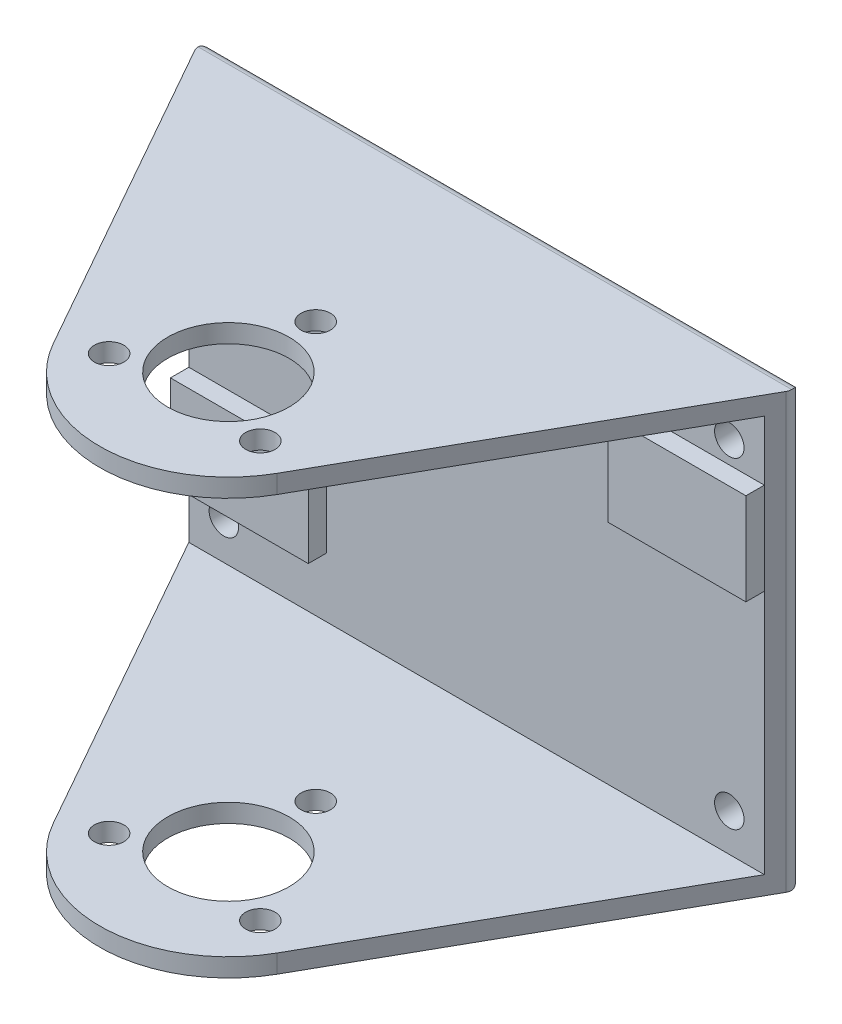
ISO-10303-21;
HEADER;
FILE_DESCRIPTION(('STEP AP214'),'2;1');
FILE_NAME('part.step','',(''),(''),'','','');
FILE_SCHEMA(('AUTOMOTIVE_DESIGN { 1 0 10303 214 1 1 1 1 }'));
ENDSEC;
DATA;
#1=APPLICATION_CONTEXT('core data for automotive mechanical design processes');
#2=APPLICATION_PROTOCOL_DEFINITION('international standard','automotive_design',2000,#1);
#3=PRODUCT_CONTEXT('',#1,'mechanical');
#4=PRODUCT('Part','Part','',(#3));
#5=PRODUCT_RELATED_PRODUCT_CATEGORY('part','',(#4));
#6=PRODUCT_DEFINITION_FORMATION('','',#4);
#7=PRODUCT_DEFINITION_CONTEXT('part definition',#1,'design');
#8=PRODUCT_DEFINITION('design','',#6,#7);
#9=PRODUCT_DEFINITION_SHAPE('','',#8);
#10=(LENGTH_UNIT() NAMED_UNIT(*) SI_UNIT(.MILLI.,.METRE.));
#11=(NAMED_UNIT(*) PLANE_ANGLE_UNIT() SI_UNIT($,.RADIAN.));
#12=(NAMED_UNIT(*) SI_UNIT($,.STERADIAN.) SOLID_ANGLE_UNIT());
#13=UNCERTAINTY_MEASURE_WITH_UNIT(LENGTH_MEASURE(1.E-05),#10,'distance_accuracy_value','');
#14=(GEOMETRIC_REPRESENTATION_CONTEXT(3) GLOBAL_UNCERTAINTY_ASSIGNED_CONTEXT((#13)) GLOBAL_UNIT_ASSIGNED_CONTEXT((#10,
#11,#12)) REPRESENTATION_CONTEXT('',''));
#15=CARTESIAN_POINT('',(0.,0.,0.));
#16=DIRECTION('',(0.,0.,1.));
#17=DIRECTION('',(1.,0.,0.));
#18=AXIS2_PLACEMENT_3D('',#15,#16,#17);
#19=CARTESIAN_POINT('',(0.,0.,-27.));
#20=DIRECTION('',(0.,0.,-1.));
#21=DIRECTION('',(-1.,0.,0.));
#22=AXIS2_PLACEMENT_3D('',#19,#20,#21);
#23=PLANE('',#22);
#24=CARTESIAN_POINT('',(27.5,6.1,-27.));
#25=DIRECTION('',(0.,0.,-1.));
#26=DIRECTION('',(-1.,0.,0.));
#27=AXIS2_PLACEMENT_3D('',#24,#25,#26);
#28=CIRCLE('',#27,1.6);
#29=CARTESIAN_POINT('',(25.9,6.1,-27.));
#30=VERTEX_POINT('',#29);
#31=EDGE_CURVE('E270',#30,#30,#28,.F.);
#32=ORIENTED_EDGE('',*,*,#31,.F.);
#33=EDGE_LOOP('',(#32));
#34=FACE_BOUND('',#33,.T.);
#35=CARTESIAN_POINT('',(-27.5,6.09999999999999,-27.));
#36=DIRECTION('',(0.,0.,-1.));
#37=DIRECTION('',(-1.,0.,0.));
#38=AXIS2_PLACEMENT_3D('',#35,#36,#37);
#39=CIRCLE('',#38,1.6);
#40=CARTESIAN_POINT('',(-29.1,6.09999999999999,-27.));
#41=VERTEX_POINT('',#40);
#42=EDGE_CURVE('E264',#41,#41,#39,.F.);
#43=ORIENTED_EDGE('',*,*,#42,.F.);
#44=EDGE_LOOP('',(#43));
#45=FACE_BOUND('',#44,.T.);
#46=CARTESIAN_POINT('',(-27.5,41.1,-27.));
#47=DIRECTION('',(0.,0.,-1.));
#48=DIRECTION('',(-1.,0.,0.));
#49=AXIS2_PLACEMENT_3D('',#46,#47,#48);
#50=CIRCLE('',#49,1.60000000000002);
#51=CARTESIAN_POINT('',(-29.1,41.1,-27.));
#52=VERTEX_POINT('',#51);
#53=EDGE_CURVE('E256',#52,#52,#50,.F.);
#54=ORIENTED_EDGE('',*,*,#53,.F.);
#55=EDGE_LOOP('',(#54));
#56=FACE_BOUND('',#55,.T.);
#57=CARTESIAN_POINT('',(27.5,41.1,-27.));
#58=DIRECTION('',(0.,0.,-1.));
#59=DIRECTION('',(-1.,0.,0.));
#60=AXIS2_PLACEMENT_3D('',#57,#58,#59);
#61=CIRCLE('',#60,1.60000000000001);
#62=CARTESIAN_POINT('',(25.9,41.1,-27.));
#63=VERTEX_POINT('',#62);
#64=EDGE_CURVE('E277',#63,#63,#61,.F.);
#65=ORIENTED_EDGE('',*,*,#64,.F.);
#66=EDGE_LOOP('',(#65));
#67=FACE_BOUND('',#66,.T.);
#68=DIRECTION('',(1.,0.,0.));
#69=VECTOR('',#68,1.);
#70=CARTESIAN_POINT('',(-31.3074444463326,8.5,-27.));
#71=LINE('',#70,#69);
#72=CARTESIAN_POINT('',(-31.3074444463326,8.5,-27.));
#73=VERTEX_POINT('',#72);
#74=CARTESIAN_POINT('',(-16.3074444463326,8.49999999999999,-27.));
#75=VERTEX_POINT('',#74);
#76=EDGE_CURVE('E190',#73,#75,#71,.T.);
#77=ORIENTED_EDGE('',*,*,#76,.F.);
#78=DIRECTION('',(0.,-1.,0.));
#79=VECTOR('',#78,1.);
#80=CARTESIAN_POINT('',(-31.3074444463326,0.,-27.));
#81=LINE('',#80,#79);
#82=CARTESIAN_POINT('',(-31.3074444463326,2.,-27.));
#83=VERTEX_POINT('',#82);
#84=EDGE_CURVE('E177',#73,#83,#81,.T.);
#85=ORIENTED_EDGE('',*,*,#84,.T.);
#86=DIRECTION('',(-1.,0.,0.));
#87=VECTOR('',#86,1.);
#88=CARTESIAN_POINT('',(33.,2.,-27.));
#89=LINE('',#88,#87);
#90=CARTESIAN_POINT('',(31.3074444463326,2.,-27.));
#91=VERTEX_POINT('',#90);
#92=EDGE_CURVE('E187',#91,#83,#89,.T.);
#93=ORIENTED_EDGE('',*,*,#92,.F.);
#94=DIRECTION('',(0.,1.,0.));
#95=VECTOR('',#94,1.);
#96=CARTESIAN_POINT('',(31.3074444463326,0.,-27.));
#97=LINE('',#96,#95);
#98=CARTESIAN_POINT('',(31.3074444463326,28.7,-27.));
#99=VERTEX_POINT('',#98);
#100=EDGE_CURVE('E335',#91,#99,#97,.T.);
#101=ORIENTED_EDGE('',*,*,#100,.T.);
#102=DIRECTION('',(1.,0.,0.));
#103=VECTOR('',#102,1.);
#104=CARTESIAN_POINT('',(31.3074444463326,28.7,-27.));
#105=LINE('',#104,#103);
#106=CARTESIAN_POINT('',(16.3074444463326,28.7,-27.));
#107=VERTEX_POINT('',#106);
#108=EDGE_CURVE('E227',#107,#99,#105,.T.);
#109=ORIENTED_EDGE('',*,*,#108,.F.);
#110=DIRECTION('',(0.,-1.,0.));
#111=VECTOR('',#110,1.);
#112=CARTESIAN_POINT('',(16.3074444463326,38.7,-27.));
#113=LINE('',#112,#111);
#114=CARTESIAN_POINT('',(16.3074444463326,38.7,-27.));
#115=VERTEX_POINT('',#114);
#116=EDGE_CURVE('E239',#115,#107,#113,.T.);
#117=ORIENTED_EDGE('',*,*,#116,.F.);
#118=DIRECTION('',(-1.,0.,0.));
#119=VECTOR('',#118,1.);
#120=CARTESIAN_POINT('',(31.3074444463326,38.7,-27.));
#121=LINE('',#120,#119);
#122=CARTESIAN_POINT('',(31.3074444463326,38.7,-27.));
#123=VERTEX_POINT('',#122);
#124=EDGE_CURVE('E236',#123,#115,#121,.T.);
#125=ORIENTED_EDGE('',*,*,#124,.F.);
#126=CARTESIAN_POINT('',(31.3074444463326,45.2,-27.));
#127=VERTEX_POINT('',#126);
#128=EDGE_CURVE('E334',#123,#127,#97,.T.);
#129=ORIENTED_EDGE('',*,*,#128,.T.);
#130=DIRECTION('',(1.,0.,0.));
#131=VECTOR('',#130,1.);
#132=CARTESIAN_POINT('',(-33.,45.2,-27.));
#133=LINE('',#132,#131);
#134=CARTESIAN_POINT('',(-31.3074444463326,45.2,-27.));
#135=VERTEX_POINT('',#134);
#136=EDGE_CURVE('E330',#135,#127,#133,.T.);
#137=ORIENTED_EDGE('',*,*,#136,.F.);
#138=CARTESIAN_POINT('',(-31.3074444463326,18.5,-27.));
#139=VERTEX_POINT('',#138);
#140=EDGE_CURVE('E186',#135,#139,#81,.T.);
#141=ORIENTED_EDGE('',*,*,#140,.T.);
#142=DIRECTION('',(-1.,0.,0.));
#143=VECTOR('',#142,1.);
#144=CARTESIAN_POINT('',(-31.3074444463326,18.5,-27.));
#145=LINE('',#144,#143);
#146=CARTESIAN_POINT('',(-16.3074444463326,18.5,-27.));
#147=VERTEX_POINT('',#146);
#148=EDGE_CURVE('E62',#147,#139,#145,.T.);
#149=ORIENTED_EDGE('',*,*,#148,.F.);
#150=DIRECTION('',(0.,1.,0.));
#151=VECTOR('',#150,1.);
#152=CARTESIAN_POINT('',(-16.3074444463326,8.49999999999999,-27.));
#153=LINE('',#152,#151);
#154=EDGE_CURVE('E57',#75,#147,#153,.T.);
#155=ORIENTED_EDGE('',*,*,#154,.F.);
#156=EDGE_LOOP('',(#77,#85,#93,#101,#109,#117,#125,#129,#137,#141,#149,#155));
#157=FACE_BOUND('',#156,.T.);
#158=ADVANCED_FACE('F40',(#34,#45,#56,#67,#157),#23,.F.);
#159=CARTESIAN_POINT('',(0.,47.2,0.));
#160=DIRECTION('',(0.,-1.,0.));
#161=DIRECTION('',(0.,0.,-1.));
#162=AXIS2_PLACEMENT_3D('',#159,#160,#161);
#163=CYLINDRICAL_SURFACE('',#162,14.);
#164=DIRECTION('',(0.,-1.,0.));
#165=VECTOR('',#164,1.);
#166=CARTESIAN_POINT('',(-12.1932674219114,47.2,6.87926083076917));
#167=LINE('',#166,#165);
#168=CARTESIAN_POINT('',(-12.1932674219114,47.2,6.87926083076917));
#169=VERTEX_POINT('',#168);
#170=CARTESIAN_POINT('',(-12.1932674219114,45.2,6.87926083076917));
#171=VERTEX_POINT('',#170);
#172=EDGE_CURVE('E356',#169,#171,#167,.T.);
#173=ORIENTED_EDGE('',*,*,#172,.T.);
#174=CARTESIAN_POINT('',(0.,45.2,0.));
#175=DIRECTION('',(0.,1.,0.));
#176=DIRECTION('',(0.,0.,1.));
#177=AXIS2_PLACEMENT_3D('',#174,#175,#176);
#178=CIRCLE('',#177,14.);
#179=CARTESIAN_POINT('',(12.1932674219114,45.2,6.87926083076916));
#180=VERTEX_POINT('',#179);
#181=EDGE_CURVE('E328',#180,#171,#178,.F.);
#182=ORIENTED_EDGE('',*,*,#181,.F.);
#183=DIRECTION('',(0.,-1.,0.));
#184=VECTOR('',#183,1.);
#185=CARTESIAN_POINT('',(12.1932674219114,47.2,6.87926083076917));
#186=LINE('',#185,#184);
#187=CARTESIAN_POINT('',(12.1932674219114,47.2,6.87926083076917));
#188=VERTEX_POINT('',#187);
#189=EDGE_CURVE('E360',#188,#180,#186,.T.);
#190=ORIENTED_EDGE('',*,*,#189,.F.);
#191=CARTESIAN_POINT('',(0.,47.2,0.));
#192=DIRECTION('',(0.,1.,0.));
#193=DIRECTION('',(0.,0.,-1.));
#194=AXIS2_PLACEMENT_3D('',#191,#192,#193);
#195=CIRCLE('',#194,14.);
#196=EDGE_CURVE('E340',#169,#188,#195,.T.);
#197=ORIENTED_EDGE('',*,*,#196,.F.);
#198=EDGE_LOOP('',(#173,#182,#190,#197));
#199=FACE_BOUND('',#198,.T.);
#200=ADVANCED_FACE('F424',(#199),#163,.T.);
#201=CARTESIAN_POINT('',(12.1932674219114,2.,6.87926083076916));
#202=VERTEX_POINT('',#201);
#203=CARTESIAN_POINT('',(12.1932674219114,0.,6.87926083076917));
#204=VERTEX_POINT('',#203);
#205=EDGE_CURVE('E359',#202,#204,#186,.T.);
#206=ORIENTED_EDGE('',*,*,#205,.F.);
#207=CARTESIAN_POINT('',(0.,2.,0.));
#208=DIRECTION('',(0.,-1.,0.));
#209=DIRECTION('',(0.,0.,-1.));
#210=AXIS2_PLACEMENT_3D('',#207,#208,#209);
#211=CIRCLE('',#210,14.);
#212=CARTESIAN_POINT('',(-12.1932674219114,2.,6.87926083076917));
#213=VERTEX_POINT('',#212);
#214=EDGE_CURVE('E337',#213,#202,#211,.F.);
#215=ORIENTED_EDGE('',*,*,#214,.F.);
#216=CARTESIAN_POINT('',(-12.1932674219114,0.,6.87926083076917));
#217=VERTEX_POINT('',#216);
#218=EDGE_CURVE('E349',#213,#217,#167,.T.);
#219=ORIENTED_EDGE('',*,*,#218,.T.);
#220=CARTESIAN_POINT('',(0.,0.,0.));
#221=DIRECTION('',(0.,1.,0.));
#222=DIRECTION('',(0.,0.,-1.));
#223=AXIS2_PLACEMENT_3D('',#220,#221,#222);
#224=CIRCLE('',#223,14.);
#225=EDGE_CURVE('E339',#217,#204,#224,.T.);
#226=ORIENTED_EDGE('',*,*,#225,.T.);
#227=EDGE_LOOP('',(#206,#215,#219,#226));
#228=FACE_BOUND('',#227,.T.);
#229=ADVANCED_FACE('F446',(#228),#163,.T.);
#230=CARTESIAN_POINT('',(33.,47.2,-30.));
#231=DIRECTION('',(-0.870947672993669,0.,-0.491375773626369));
#232=DIRECTION('',(-0.491375773626369,0.,0.870947672993669));
#233=AXIS2_PLACEMENT_3D('',#230,#231,#232);
#234=PLANE('',#233);
#235=DIRECTION('',(0.491375773626369,0.,-0.870947672993669));
#236=VECTOR('',#235,1.);
#237=CARTESIAN_POINT('',(33.,0.,-30.));
#238=LINE('',#237,#236);
#239=CARTESIAN_POINT('',(32.1585878839146,0.,-28.5086242263736));
#240=VERTEX_POINT('',#239);
#241=EDGE_CURVE('E352',#204,#240,#238,.T.);
#242=ORIENTED_EDGE('',*,*,#241,.T.);
#243=DIRECTION('',(0.,-1.,0.));
#244=VECTOR('',#243,1.);
#245=CARTESIAN_POINT('',(32.1585878839146,47.2,-28.5086242263736));
#246=LINE('',#245,#244);
#247=CARTESIAN_POINT('',(32.1585878839146,47.2,-28.5086242263736));
#248=VERTEX_POINT('',#247);
#249=EDGE_CURVE('E386',#240,#248,#246,.F.);
#250=ORIENTED_EDGE('',*,*,#249,.T.);
#251=DIRECTION('',(0.491375773626369,0.,-0.870947672993669));
#252=VECTOR('',#251,1.);
#253=CARTESIAN_POINT('',(33.,47.2,-30.));
#254=LINE('',#253,#252);
#255=EDGE_CURVE('E343',#188,#248,#254,.T.);
#256=ORIENTED_EDGE('',*,*,#255,.F.);
#257=ORIENTED_EDGE('',*,*,#189,.T.);
#258=DIRECTION('',(-0.491375773626369,0.,0.870947672993669));
#259=VECTOR('',#258,1.);
#260=CARTESIAN_POINT('',(-1.76649173307826,45.2,31.622482625898));
#261=LINE('',#260,#259);
#262=EDGE_CURVE('E326',#127,#180,#261,.T.);
#263=ORIENTED_EDGE('',*,*,#262,.F.);
#264=ORIENTED_EDGE('',*,*,#128,.F.);
#265=DIRECTION('',(0.,1.,0.));
#266=VECTOR('',#265,1.);
#267=CARTESIAN_POINT('',(31.3074444463326,38.7,-27.));
#268=LINE('',#267,#266);
#269=EDGE_CURVE('E194',#99,#123,#268,.T.);
#270=ORIENTED_EDGE('',*,*,#269,.F.);
#271=ORIENTED_EDGE('',*,*,#100,.F.);
#272=DIRECTION('',(0.491375773626369,0.,-0.870947672993669));
#273=VECTOR('',#272,1.);
#274=CARTESIAN_POINT('',(14.169218226778,2.,3.37695190994493));
#275=LINE('',#274,#273);
#276=EDGE_CURVE('E323',#202,#91,#275,.T.);
#277=ORIENTED_EDGE('',*,*,#276,.F.);
#278=ORIENTED_EDGE('',*,*,#205,.T.);
#279=EDGE_LOOP('',(#242,#250,#256,#257,#263,#264,#270,#271,#277,#278));
#280=FACE_BOUND('',#279,.T.);
#281=ADVANCED_FACE('F426',(#280),#234,.F.);
#282=CARTESIAN_POINT('',(-33.,47.2,-30.));
#283=DIRECTION('',(0.,0.,1.));
#284=DIRECTION('',(1.,0.,0.));
#285=AXIS2_PLACEMENT_3D('',#282,#283,#284);
#286=PLANE('',#285);
#287=DIRECTION('',(-1.,0.,0.));
#288=VECTOR('',#287,1.);
#289=CARTESIAN_POINT('',(-33.,46.2,-30.));
#290=LINE('',#289,#288);
#291=CARTESIAN_POINT('',(-31.2876402109209,46.2,-30.));
#292=VERTEX_POINT('',#291);
#293=CARTESIAN_POINT('',(31.2876402109209,46.2,-30.));
#294=VERTEX_POINT('',#293);
#295=EDGE_CURVE('E373',#292,#294,#290,.F.);
#296=ORIENTED_EDGE('',*,*,#295,.T.);
#297=DIRECTION('',(0.,-1.,0.));
#298=VECTOR('',#297,1.);
#299=CARTESIAN_POINT('',(31.2876402109209,47.2,-30.));
#300=LINE('',#299,#298);
#301=CARTESIAN_POINT('',(31.2876402109209,1.,-30.));
#302=VERTEX_POINT('',#301);
#303=EDGE_CURVE('E377',#294,#302,#300,.T.);
#304=ORIENTED_EDGE('',*,*,#303,.T.);
#305=DIRECTION('',(-1.,0.,0.));
#306=VECTOR('',#305,1.);
#307=CARTESIAN_POINT('',(-33.,1.,-30.));
#308=LINE('',#307,#306);
#309=CARTESIAN_POINT('',(-31.2876402109209,1.,-30.));
#310=VERTEX_POINT('',#309);
#311=EDGE_CURVE('E375',#302,#310,#308,.T.);
#312=ORIENTED_EDGE('',*,*,#311,.T.);
#313=DIRECTION('',(0.,-1.,0.));
#314=VECTOR('',#313,1.);
#315=CARTESIAN_POINT('',(-31.2876402109209,47.2,-30.));
#316=LINE('',#315,#314);
#317=EDGE_CURVE('E363',#310,#292,#316,.F.);
#318=ORIENTED_EDGE('',*,*,#317,.T.);
#319=EDGE_LOOP('',(#296,#304,#312,#318));
#320=FACE_BOUND('',#319,.T.);
#321=CARTESIAN_POINT('',(27.5,6.1,-30.));
#322=DIRECTION('',(0.,0.,-1.));
#323=DIRECTION('',(1.,0.,0.));
#324=AXIS2_PLACEMENT_3D('',#321,#322,#323);
#325=CIRCLE('',#324,1.6);
#326=CARTESIAN_POINT('',(29.1,6.1,-30.));
#327=VERTEX_POINT('',#326);
#328=EDGE_CURVE('E267',#327,#327,#325,.T.);
#329=ORIENTED_EDGE('',*,*,#328,.F.);
#330=EDGE_LOOP('',(#329));
#331=FACE_BOUND('',#330,.T.);
#332=CARTESIAN_POINT('',(-27.5,6.09999999999999,-30.));
#333=DIRECTION('',(0.,0.,-1.));
#334=DIRECTION('',(-1.,0.,0.));
#335=AXIS2_PLACEMENT_3D('',#332,#333,#334);
#336=CIRCLE('',#335,1.6);
#337=CARTESIAN_POINT('',(-29.1,6.09999999999999,-30.));
#338=VERTEX_POINT('',#337);
#339=EDGE_CURVE('E260',#338,#338,#336,.T.);
#340=ORIENTED_EDGE('',*,*,#339,.F.);
#341=EDGE_LOOP('',(#340));
#342=FACE_BOUND('',#341,.T.);
#343=CARTESIAN_POINT('',(-27.5,41.1,-30.));
#344=DIRECTION('',(0.,0.,-1.));
#345=DIRECTION('',(1.,0.,0.));
#346=AXIS2_PLACEMENT_3D('',#343,#344,#345);
#347=CIRCLE('',#346,1.60000000000002);
#348=CARTESIAN_POINT('',(-25.9,41.1,-30.));
#349=VERTEX_POINT('',#348);
#350=EDGE_CURVE('E259',#349,#349,#347,.T.);
#351=ORIENTED_EDGE('',*,*,#350,.F.);
#352=EDGE_LOOP('',(#351));
#353=FACE_BOUND('',#352,.T.);
#354=CARTESIAN_POINT('',(27.5,41.1,-30.));
#355=DIRECTION('',(0.,0.,-1.));
#356=DIRECTION('',(-1.,0.,0.));
#357=AXIS2_PLACEMENT_3D('',#354,#355,#356);
#358=CIRCLE('',#357,1.60000000000001);
#359=CARTESIAN_POINT('',(25.9,41.1,-30.));
#360=VERTEX_POINT('',#359);
#361=EDGE_CURVE('E263',#360,#360,#358,.T.);
#362=ORIENTED_EDGE('',*,*,#361,.F.);
#363=EDGE_LOOP('',(#362));
#364=FACE_BOUND('',#363,.T.);
#365=ADVANCED_FACE('F436',(#320,#331,#342,#353,#364),#286,.F.);
#366=CARTESIAN_POINT('',(-12.1932674219114,47.2,6.87926083076917));
#367=DIRECTION('',(0.870947672993669,0.,-0.491375773626369));
#368=DIRECTION('',(-0.491375773626369,0.,-0.870947672993669));
#369=AXIS2_PLACEMENT_3D('',#366,#367,#368);
#370=PLANE('',#369);
#371=DIRECTION('',(0.491375773626369,0.,0.870947672993669));
#372=VECTOR('',#371,1.);
#373=CARTESIAN_POINT('',(-12.1932674219114,47.2,6.87926083076917));
#374=LINE('',#373,#372);
#375=CARTESIAN_POINT('',(-32.1585878839146,47.2,-28.5086242263736));
#376=VERTEX_POINT('',#375);
#377=EDGE_CURVE('E347',#376,#169,#374,.T.);
#378=ORIENTED_EDGE('',*,*,#377,.F.);
#379=DIRECTION('',(0.,-1.,0.));
#380=VECTOR('',#379,1.);
#381=CARTESIAN_POINT('',(-32.1585878839146,47.2,-28.5086242263736));
#382=LINE('',#381,#380);
#383=CARTESIAN_POINT('',(-32.1585878839146,0.,-28.5086242263736));
#384=VERTEX_POINT('',#383);
#385=EDGE_CURVE('E11',#376,#384,#382,.T.);
#386=ORIENTED_EDGE('',*,*,#385,.T.);
#387=DIRECTION('',(0.491375773626369,0.,0.870947672993669));
#388=VECTOR('',#387,1.);
#389=CARTESIAN_POINT('',(-12.1932674219114,0.,6.87926083076917));
#390=LINE('',#389,#388);
#391=EDGE_CURVE('E344',#384,#217,#390,.T.);
#392=ORIENTED_EDGE('',*,*,#391,.T.);
#393=ORIENTED_EDGE('',*,*,#218,.F.);
#394=DIRECTION('',(0.491375773626369,0.,0.870947672993669));
#395=VECTOR('',#394,1.);
#396=CARTESIAN_POINT('',(1.76649173307827,2.,31.622482625898));
#397=LINE('',#396,#395);
#398=EDGE_CURVE('E184',#83,#213,#397,.T.);
#399=ORIENTED_EDGE('',*,*,#398,.F.);
#400=ORIENTED_EDGE('',*,*,#84,.F.);
#401=DIRECTION('',(0.,-1.,0.));
#402=VECTOR('',#401,1.);
#403=CARTESIAN_POINT('',(-31.3074444463326,8.5,-27.));
#404=LINE('',#403,#402);
#405=EDGE_CURVE('E182',#139,#73,#404,.T.);
#406=ORIENTED_EDGE('',*,*,#405,.F.);
#407=ORIENTED_EDGE('',*,*,#140,.F.);
#408=DIRECTION('',(-0.491375773626369,0.,-0.870947672993669));
#409=VECTOR('',#408,1.);
#410=CARTESIAN_POINT('',(-14.169218226778,45.2,3.37695190994493));
#411=LINE('',#410,#409);
#412=EDGE_CURVE('E321',#171,#135,#411,.T.);
#413=ORIENTED_EDGE('',*,*,#412,.F.);
#414=ORIENTED_EDGE('',*,*,#172,.F.);
#415=EDGE_LOOP('',(#378,#386,#392,#393,#399,#400,#406,#407,#413,#414));
#416=FACE_BOUND('',#415,.T.);
#417=ADVANCED_FACE('F179',(#416),#370,.F.);
#418=CARTESIAN_POINT('',(0.,47.2,0.));
#419=DIRECTION('',(0.,-1.,0.));
#420=DIRECTION('',(0.,0.,-1.));
#421=AXIS2_PLACEMENT_3D('',#418,#419,#420);
#422=PLANE('',#421);
#423=CARTESIAN_POINT('',(-8.22724133595217,47.2,4.75));
#424=DIRECTION('',(0.,1.,0.));
#425=DIRECTION('',(0.,0.,1.));
#426=AXIS2_PLACEMENT_3D('',#423,#424,#425);
#427=CIRCLE('',#426,1.6);
#428=CARTESIAN_POINT('',(-8.22724133595217,47.2,6.35));
#429=VERTEX_POINT('',#428);
#430=EDGE_CURVE('E281',#429,#429,#427,.T.);
#431=ORIENTED_EDGE('',*,*,#430,.F.);
#432=EDGE_LOOP('',(#431));
#433=FACE_BOUND('',#432,.T.);
#434=CARTESIAN_POINT('',(8.22724133595217,47.2,4.75000000000001));
#435=DIRECTION('',(0.,1.,0.));
#436=DIRECTION('',(0.,0.,1.));
#437=AXIS2_PLACEMENT_3D('',#434,#435,#436);
#438=CIRCLE('',#437,1.6);
#439=CARTESIAN_POINT('',(8.22724133595217,47.2,6.35000000000001));
#440=VERTEX_POINT('',#439);
#441=EDGE_CURVE('E285',#440,#440,#438,.T.);
#442=ORIENTED_EDGE('',*,*,#441,.F.);
#443=EDGE_LOOP('',(#442));
#444=FACE_BOUND('',#443,.T.);
#445=CARTESIAN_POINT('',(0.,47.2,0.));
#446=DIRECTION('',(0.,1.,0.));
#447=DIRECTION('',(0.,0.,1.));
#448=AXIS2_PLACEMENT_3D('',#445,#446,#447);
#449=CIRCLE('',#448,6.6);
#450=CARTESIAN_POINT('',(0.,47.2,6.6));
#451=VERTEX_POINT('',#450);
#452=EDGE_CURVE('E292',#451,#451,#449,.T.);
#453=ORIENTED_EDGE('',*,*,#452,.F.);
#454=EDGE_LOOP('',(#453));
#455=FACE_BOUND('',#454,.T.);
#456=CARTESIAN_POINT('',(0.,47.2,-9.5));
#457=DIRECTION('',(0.,1.,0.));
#458=DIRECTION('',(0.,0.,1.));
#459=AXIS2_PLACEMENT_3D('',#456,#457,#458);
#460=CIRCLE('',#459,1.6);
#461=CARTESIAN_POINT('',(0.,47.2,-7.9));
#462=VERTEX_POINT('',#461);
#463=EDGE_CURVE('E298',#462,#462,#460,.T.);
#464=ORIENTED_EDGE('',*,*,#463,.F.);
#465=EDGE_LOOP('',(#464));
#466=FACE_BOUND('',#465,.T.);
#467=ORIENTED_EDGE('',*,*,#255,.T.);
#468=CARTESIAN_POINT('',(31.2876402109209,47.2,-29.));
#469=DIRECTION('',(0.,-1.,0.));
#470=DIRECTION('',(0.,0.,-1.));
#471=AXIS2_PLACEMENT_3D('',#468,#469,#470);
#472=CIRCLE('',#471,1.);
#473=CARTESIAN_POINT('',(32.2876402109209,47.2,-29.));
#474=VERTEX_POINT('',#473);
#475=EDGE_CURVE('E49',#248,#474,#472,.F.);
#476=ORIENTED_EDGE('',*,*,#475,.T.);
#477=DIRECTION('',(-1.,0.,0.));
#478=VECTOR('',#477,1.);
#479=CARTESIAN_POINT('',(0.,47.2,-29.));
#480=LINE('',#479,#478);
#481=CARTESIAN_POINT('',(-32.2876402109209,47.2,-29.));
#482=VERTEX_POINT('',#481);
#483=EDGE_CURVE('E391',#474,#482,#480,.T.);
#484=ORIENTED_EDGE('',*,*,#483,.T.);
#485=CARTESIAN_POINT('',(-31.2876402109209,47.2,-29.));
#486=DIRECTION('',(0.,-1.,0.));
#487=DIRECTION('',(0.,0.,-1.));
#488=AXIS2_PLACEMENT_3D('',#485,#486,#487);
#489=CIRCLE('',#488,1.);
#490=EDGE_CURVE('E389',#482,#376,#489,.F.);
#491=ORIENTED_EDGE('',*,*,#490,.T.);
#492=ORIENTED_EDGE('',*,*,#377,.T.);
#493=ORIENTED_EDGE('',*,*,#196,.T.);
#494=EDGE_LOOP('',(#467,#476,#484,#491,#492,#493));
#495=FACE_BOUND('',#494,.T.);
#496=ADVANCED_FACE('F416',(#433,#444,#455,#466,#495),#422,.F.);
#497=CARTESIAN_POINT('',(0.,0.,0.));
#498=DIRECTION('',(0.,-1.,0.));
#499=DIRECTION('',(0.,0.,-1.));
#500=AXIS2_PLACEMENT_3D('',#497,#498,#499);
#501=PLANE('',#500);
#502=CARTESIAN_POINT('',(-8.22724133595217,0.,4.75));
#503=DIRECTION('',(0.,-1.,0.));
#504=DIRECTION('',(0.,0.,-1.));
#505=AXIS2_PLACEMENT_3D('',#502,#503,#504);
#506=CIRCLE('',#505,1.6);
#507=CARTESIAN_POINT('',(-8.22724133595217,0.,3.15));
#508=VERTEX_POINT('',#507);
#509=EDGE_CURVE('E284',#508,#508,#506,.F.);
#510=ORIENTED_EDGE('',*,*,#509,.T.);
#511=EDGE_LOOP('',(#510));
#512=FACE_BOUND('',#511,.T.);
#513=CARTESIAN_POINT('',(8.22724133595217,0.,4.75000000000001));
#514=DIRECTION('',(0.,-1.,0.));
#515=DIRECTION('',(0.,0.,-1.));
#516=AXIS2_PLACEMENT_3D('',#513,#514,#515);
#517=CIRCLE('',#516,1.6);
#518=CARTESIAN_POINT('',(8.22724133595217,0.,3.15));
#519=VERTEX_POINT('',#518);
#520=EDGE_CURVE('E289',#519,#519,#517,.F.);
#521=ORIENTED_EDGE('',*,*,#520,.T.);
#522=EDGE_LOOP('',(#521));
#523=FACE_BOUND('',#522,.T.);
#524=CARTESIAN_POINT('',(0.,0.,0.));
#525=DIRECTION('',(0.,-1.,0.));
#526=DIRECTION('',(0.,0.,-1.));
#527=AXIS2_PLACEMENT_3D('',#524,#525,#526);
#528=CIRCLE('',#527,6.6);
#529=CARTESIAN_POINT('',(0.,0.,-6.6));
#530=VERTEX_POINT('',#529);
#531=EDGE_CURVE('E295',#530,#530,#528,.F.);
#532=ORIENTED_EDGE('',*,*,#531,.T.);
#533=EDGE_LOOP('',(#532));
#534=FACE_BOUND('',#533,.T.);
#535=CARTESIAN_POINT('',(0.,0.,-9.5));
#536=DIRECTION('',(0.,-1.,0.));
#537=DIRECTION('',(0.,0.,-1.));
#538=AXIS2_PLACEMENT_3D('',#535,#536,#537);
#539=CIRCLE('',#538,1.6);
#540=CARTESIAN_POINT('',(0.,0.,-11.1));
#541=VERTEX_POINT('',#540);
#542=EDGE_CURVE('E280',#541,#541,#539,.F.);
#543=ORIENTED_EDGE('',*,*,#542,.T.);
#544=EDGE_LOOP('',(#543));
#545=FACE_BOUND('',#544,.T.);
#546=DIRECTION('',(-1.,0.,0.));
#547=VECTOR('',#546,1.);
#548=CARTESIAN_POINT('',(33.,0.,-29.));
#549=LINE('',#548,#547);
#550=CARTESIAN_POINT('',(-32.2876402109209,0.,-29.));
#551=VERTEX_POINT('',#550);
#552=CARTESIAN_POINT('',(32.2876402109209,0.,-29.));
#553=VERTEX_POINT('',#552);
#554=EDGE_CURVE('E382',#551,#553,#549,.F.);
#555=ORIENTED_EDGE('',*,*,#554,.T.);
#556=CARTESIAN_POINT('',(31.2876402109209,0.,-29.));
#557=DIRECTION('',(0.,-1.,0.));
#558=DIRECTION('',(0.,0.,-1.));
#559=AXIS2_PLACEMENT_3D('',#556,#557,#558);
#560=CIRCLE('',#559,1.);
#561=EDGE_CURVE('E384',#553,#240,#560,.T.);
#562=ORIENTED_EDGE('',*,*,#561,.T.);
#563=ORIENTED_EDGE('',*,*,#241,.F.);
#564=ORIENTED_EDGE('',*,*,#225,.F.);
#565=ORIENTED_EDGE('',*,*,#391,.F.);
#566=CARTESIAN_POINT('',(-31.2876402109209,0.,-29.));
#567=DIRECTION('',(0.,-1.,0.));
#568=DIRECTION('',(0.,0.,-1.));
#569=AXIS2_PLACEMENT_3D('',#566,#567,#568);
#570=CIRCLE('',#569,1.);
#571=EDGE_CURVE('E380',#384,#551,#570,.T.);
#572=ORIENTED_EDGE('',*,*,#571,.T.);
#573=EDGE_LOOP('',(#555,#562,#563,#564,#565,#572));
#574=FACE_BOUND('',#573,.T.);
#575=ADVANCED_FACE('F440',(#512,#523,#534,#545,#574),#501,.T.);
#576=CARTESIAN_POINT('',(-33.,45.2,14.001));
#577=DIRECTION('',(0.,1.,0.));
#578=DIRECTION('',(0.,0.,1.));
#579=AXIS2_PLACEMENT_3D('',#576,#577,#578);
#580=PLANE('',#579);
#581=CARTESIAN_POINT('',(-8.22724133595217,45.2,4.75));
#582=DIRECTION('',(0.,1.,0.));
#583=DIRECTION('',(0.,0.,1.));
#584=AXIS2_PLACEMENT_3D('',#581,#582,#583);
#585=CIRCLE('',#584,1.6);
#586=CARTESIAN_POINT('',(-8.22724133595217,45.2,6.35));
#587=VERTEX_POINT('',#586);
#588=EDGE_CURVE('E317',#587,#587,#585,.T.);
#589=ORIENTED_EDGE('',*,*,#588,.T.);
#590=EDGE_LOOP('',(#589));
#591=FACE_BOUND('',#590,.T.);
#592=CARTESIAN_POINT('',(8.22724133595217,45.2,4.75000000000001));
#593=DIRECTION('',(0.,1.,0.));
#594=DIRECTION('',(0.,0.,1.));
#595=AXIS2_PLACEMENT_3D('',#592,#593,#594);
#596=CIRCLE('',#595,1.6);
#597=CARTESIAN_POINT('',(8.22724133595217,45.2,6.35000000000001));
#598=VERTEX_POINT('',#597);
#599=EDGE_CURVE('E313',#598,#598,#596,.T.);
#600=ORIENTED_EDGE('',*,*,#599,.T.);
#601=EDGE_LOOP('',(#600));
#602=FACE_BOUND('',#601,.T.);
#603=CARTESIAN_POINT('',(0.,45.2,0.));
#604=DIRECTION('',(0.,1.,0.));
#605=DIRECTION('',(0.,0.,1.));
#606=AXIS2_PLACEMENT_3D('',#603,#604,#605);
#607=CIRCLE('',#606,6.6);
#608=CARTESIAN_POINT('',(0.,45.2,6.6));
#609=VERTEX_POINT('',#608);
#610=EDGE_CURVE('E309',#609,#609,#607,.T.);
#611=ORIENTED_EDGE('',*,*,#610,.T.);
#612=EDGE_LOOP('',(#611));
#613=FACE_BOUND('',#612,.T.);
#614=CARTESIAN_POINT('',(0.,45.2,-9.5));
#615=DIRECTION('',(0.,1.,0.));
#616=DIRECTION('',(0.,0.,1.));
#617=AXIS2_PLACEMENT_3D('',#614,#615,#616);
#618=CIRCLE('',#617,1.6);
#619=CARTESIAN_POINT('',(0.,45.2,-7.9));
#620=VERTEX_POINT('',#619);
#621=EDGE_CURVE('E305',#620,#620,#618,.T.);
#622=ORIENTED_EDGE('',*,*,#621,.T.);
#623=EDGE_LOOP('',(#622));
#624=FACE_BOUND('',#623,.T.);
#625=ORIENTED_EDGE('',*,*,#262,.T.);
#626=ORIENTED_EDGE('',*,*,#181,.T.);
#627=ORIENTED_EDGE('',*,*,#412,.T.);
#628=ORIENTED_EDGE('',*,*,#136,.T.);
#629=EDGE_LOOP('',(#625,#626,#627,#628));
#630=FACE_BOUND('',#629,.T.);
#631=ADVANCED_FACE('F470',(#591,#602,#613,#624,#630),#580,.F.);
#632=CARTESIAN_POINT('',(33.,2.,14.001));
#633=DIRECTION('',(0.,-1.,0.));
#634=DIRECTION('',(0.,0.,-1.));
#635=AXIS2_PLACEMENT_3D('',#632,#633,#634);
#636=PLANE('',#635);
#637=CARTESIAN_POINT('',(-8.22724133595217,2.,4.75));
#638=DIRECTION('',(0.,-1.,0.));
#639=DIRECTION('',(0.,0.,-1.));
#640=AXIS2_PLACEMENT_3D('',#637,#638,#639);
#641=CIRCLE('',#640,1.6);
#642=CARTESIAN_POINT('',(-8.22724133595217,2.,3.15));
#643=VERTEX_POINT('',#642);
#644=EDGE_CURVE('E316',#643,#643,#641,.T.);
#645=ORIENTED_EDGE('',*,*,#644,.T.);
#646=EDGE_LOOP('',(#645));
#647=FACE_BOUND('',#646,.T.);
#648=CARTESIAN_POINT('',(8.22724133595217,2.,4.75000000000001));
#649=DIRECTION('',(0.,-1.,0.));
#650=DIRECTION('',(0.,0.,-1.));
#651=AXIS2_PLACEMENT_3D('',#648,#649,#650);
#652=CIRCLE('',#651,1.6);
#653=CARTESIAN_POINT('',(8.22724133595217,2.,3.15));
#654=VERTEX_POINT('',#653);
#655=EDGE_CURVE('E312',#654,#654,#652,.T.);
#656=ORIENTED_EDGE('',*,*,#655,.T.);
#657=EDGE_LOOP('',(#656));
#658=FACE_BOUND('',#657,.T.);
#659=CARTESIAN_POINT('',(0.,2.,0.));
#660=DIRECTION('',(0.,-1.,0.));
#661=DIRECTION('',(0.,0.,-1.));
#662=AXIS2_PLACEMENT_3D('',#659,#660,#661);
#663=CIRCLE('',#662,6.6);
#664=CARTESIAN_POINT('',(0.,2.,-6.6));
#665=VERTEX_POINT('',#664);
#666=EDGE_CURVE('E308',#665,#665,#663,.T.);
#667=ORIENTED_EDGE('',*,*,#666,.T.);
#668=EDGE_LOOP('',(#667));
#669=FACE_BOUND('',#668,.T.);
#670=CARTESIAN_POINT('',(0.,2.,-9.5));
#671=DIRECTION('',(0.,-1.,0.));
#672=DIRECTION('',(0.,0.,-1.));
#673=AXIS2_PLACEMENT_3D('',#670,#671,#672);
#674=CIRCLE('',#673,1.6);
#675=CARTESIAN_POINT('',(0.,2.,-11.1));
#676=VERTEX_POINT('',#675);
#677=EDGE_CURVE('E288',#676,#676,#674,.T.);
#678=ORIENTED_EDGE('',*,*,#677,.T.);
#679=EDGE_LOOP('',(#678));
#680=FACE_BOUND('',#679,.T.);
#681=ORIENTED_EDGE('',*,*,#276,.T.);
#682=ORIENTED_EDGE('',*,*,#92,.T.);
#683=ORIENTED_EDGE('',*,*,#398,.T.);
#684=ORIENTED_EDGE('',*,*,#214,.T.);
#685=EDGE_LOOP('',(#681,#682,#683,#684));
#686=FACE_BOUND('',#685,.T.);
#687=ADVANCED_FACE('F449',(#647,#658,#669,#680,#686),#636,.F.);
#688=CARTESIAN_POINT('',(0.,-18.6676190233249,-9.5));
#689=DIRECTION('',(0.,1.,0.));
#690=DIRECTION('',(0.,0.,1.));
#691=AXIS2_PLACEMENT_3D('',#688,#689,#690);
#692=CYLINDRICAL_SURFACE('',#691,1.6);
#693=ORIENTED_EDGE('',*,*,#542,.F.);
#694=EDGE_LOOP('',(#693));
#695=FACE_BOUND('',#694,.T.);
#696=ORIENTED_EDGE('',*,*,#677,.F.);
#697=EDGE_LOOP('',(#696));
#698=FACE_BOUND('',#697,.T.);
#699=ADVANCED_FACE('F506',(#695,#698),#692,.F.);
#700=CARTESIAN_POINT('',(0.,-18.6676190233249,0.));
#701=DIRECTION('',(0.,1.,0.));
#702=DIRECTION('',(0.,0.,1.));
#703=AXIS2_PLACEMENT_3D('',#700,#701,#702);
#704=CYLINDRICAL_SURFACE('',#703,6.6);
#705=ORIENTED_EDGE('',*,*,#531,.F.);
#706=EDGE_LOOP('',(#705));
#707=FACE_BOUND('',#706,.T.);
#708=ORIENTED_EDGE('',*,*,#666,.F.);
#709=EDGE_LOOP('',(#708));
#710=FACE_BOUND('',#709,.T.);
#711=ADVANCED_FACE('F563',(#707,#710),#704,.F.);
#712=CARTESIAN_POINT('',(8.22724133595217,-18.6676190233249,4.75000000000001));
#713=DIRECTION('',(0.,1.,0.));
#714=DIRECTION('',(0.,0.,1.));
#715=AXIS2_PLACEMENT_3D('',#712,#713,#714);
#716=CYLINDRICAL_SURFACE('',#715,1.6);
#717=ORIENTED_EDGE('',*,*,#520,.F.);
#718=EDGE_LOOP('',(#717));
#719=FACE_BOUND('',#718,.T.);
#720=ORIENTED_EDGE('',*,*,#655,.F.);
#721=EDGE_LOOP('',(#720));
#722=FACE_BOUND('',#721,.T.);
#723=ADVANCED_FACE('F560',(#719,#722),#716,.F.);
#724=CARTESIAN_POINT('',(-8.22724133595217,-18.6676190233249,4.75));
#725=DIRECTION('',(0.,1.,0.));
#726=DIRECTION('',(0.,0.,1.));
#727=AXIS2_PLACEMENT_3D('',#724,#725,#726);
#728=CYLINDRICAL_SURFACE('',#727,1.6);
#729=ORIENTED_EDGE('',*,*,#509,.F.);
#730=EDGE_LOOP('',(#729));
#731=FACE_BOUND('',#730,.T.);
#732=ORIENTED_EDGE('',*,*,#644,.F.);
#733=EDGE_LOOP('',(#732));
#734=FACE_BOUND('',#733,.T.);
#735=ADVANCED_FACE('F556',(#731,#734),#728,.F.);
#736=ORIENTED_EDGE('',*,*,#463,.T.);
#737=EDGE_LOOP('',(#736));
#738=FACE_BOUND('',#737,.T.);
#739=ORIENTED_EDGE('',*,*,#621,.F.);
#740=EDGE_LOOP('',(#739));
#741=FACE_BOUND('',#740,.T.);
#742=ADVANCED_FACE('F502',(#738,#741),#692,.F.);
#743=ORIENTED_EDGE('',*,*,#452,.T.);
#744=EDGE_LOOP('',(#743));
#745=FACE_BOUND('',#744,.T.);
#746=ORIENTED_EDGE('',*,*,#610,.F.);
#747=EDGE_LOOP('',(#746));
#748=FACE_BOUND('',#747,.T.);
#749=ADVANCED_FACE('F558',(#745,#748),#704,.F.);
#750=ORIENTED_EDGE('',*,*,#441,.T.);
#751=EDGE_LOOP('',(#750));
#752=FACE_BOUND('',#751,.T.);
#753=ORIENTED_EDGE('',*,*,#599,.F.);
#754=EDGE_LOOP('',(#753));
#755=FACE_BOUND('',#754,.T.);
#756=ADVANCED_FACE('F554',(#752,#755),#716,.F.);
#757=ORIENTED_EDGE('',*,*,#430,.T.);
#758=EDGE_LOOP('',(#757));
#759=FACE_BOUND('',#758,.T.);
#760=ORIENTED_EDGE('',*,*,#588,.F.);
#761=EDGE_LOOP('',(#760));
#762=FACE_BOUND('',#761,.T.);
#763=ADVANCED_FACE('F550',(#759,#762),#728,.F.);
#764=CARTESIAN_POINT('',(27.5,41.1,14.001));
#765=DIRECTION('',(0.,0.,-1.));
#766=DIRECTION('',(-1.,0.,0.));
#767=AXIS2_PLACEMENT_3D('',#764,#765,#766);
#768=CYLINDRICAL_SURFACE('',#767,1.60000000000001);
#769=ORIENTED_EDGE('',*,*,#361,.T.);
#770=EDGE_LOOP('',(#769));
#771=FACE_BOUND('',#770,.T.);
#772=ORIENTED_EDGE('',*,*,#64,.T.);
#773=EDGE_LOOP('',(#772));
#774=FACE_BOUND('',#773,.T.);
#775=ADVANCED_FACE('F547',(#771,#774),#768,.F.);
#776=CARTESIAN_POINT('',(-27.5,41.1,14.001));
#777=DIRECTION('',(0.,0.,-1.));
#778=DIRECTION('',(-1.,0.,0.));
#779=AXIS2_PLACEMENT_3D('',#776,#777,#778);
#780=CYLINDRICAL_SURFACE('',#779,1.60000000000002);
#781=ORIENTED_EDGE('',*,*,#350,.T.);
#782=EDGE_LOOP('',(#781));
#783=FACE_BOUND('',#782,.T.);
#784=ORIENTED_EDGE('',*,*,#53,.T.);
#785=EDGE_LOOP('',(#784));
#786=FACE_BOUND('',#785,.T.);
#787=ADVANCED_FACE('F541',(#783,#786),#780,.F.);
#788=CARTESIAN_POINT('',(-27.5,6.09999999999999,14.001));
#789=DIRECTION('',(0.,0.,-1.));
#790=DIRECTION('',(-1.,0.,0.));
#791=AXIS2_PLACEMENT_3D('',#788,#789,#790);
#792=CYLINDRICAL_SURFACE('',#791,1.6);
#793=ORIENTED_EDGE('',*,*,#339,.T.);
#794=EDGE_LOOP('',(#793));
#795=FACE_BOUND('',#794,.T.);
#796=ORIENTED_EDGE('',*,*,#42,.T.);
#797=EDGE_LOOP('',(#796));
#798=FACE_BOUND('',#797,.T.);
#799=ADVANCED_FACE('F535',(#795,#798),#792,.F.);
#800=CARTESIAN_POINT('',(27.5,6.1,14.001));
#801=DIRECTION('',(0.,0.,-1.));
#802=DIRECTION('',(-1.,0.,0.));
#803=AXIS2_PLACEMENT_3D('',#800,#801,#802);
#804=CYLINDRICAL_SURFACE('',#803,1.6);
#805=ORIENTED_EDGE('',*,*,#328,.T.);
#806=EDGE_LOOP('',(#805));
#807=FACE_BOUND('',#806,.T.);
#808=ORIENTED_EDGE('',*,*,#31,.T.);
#809=EDGE_LOOP('',(#808));
#810=FACE_BOUND('',#809,.T.);
#811=ADVANCED_FACE('F531',(#807,#810),#804,.F.);
#812=CARTESIAN_POINT('',(-31.2876402109209,47.2,-29.));
#813=DIRECTION('',(0.,-1.,0.));
#814=DIRECTION('',(0.,0.,-1.));
#815=AXIS2_PLACEMENT_3D('',#812,#813,#814);
#816=CYLINDRICAL_SURFACE('',#815,1.);
#817=ORIENTED_EDGE('',*,*,#385,.F.);
#818=ORIENTED_EDGE('',*,*,#490,.F.);
#819=CARTESIAN_POINT('',(-31.2876402109209,46.2,-29.));
#820=DIRECTION('',(-0.707106781186548,-0.707106781186547,0.));
#821=DIRECTION('',(0.707106781186548,-0.707106781186547,0.));
#822=AXIS2_PLACEMENT_3D('',#819,#820,#821);
#823=ELLIPSE('',#822,1.41421356237309,1.);
#824=EDGE_CURVE('E44',#292,#482,#823,.F.);
#825=ORIENTED_EDGE('',*,*,#824,.F.);
#826=ORIENTED_EDGE('',*,*,#317,.F.);
#827=CARTESIAN_POINT('',(-31.2876402109209,1.,-29.));
#828=DIRECTION('',(0.707106781186548,-0.707106781186547,0.));
#829=DIRECTION('',(-0.707106781186548,-0.707106781186547,0.));
#830=AXIS2_PLACEMENT_3D('',#827,#828,#829);
#831=ELLIPSE('',#830,1.41421356237309,1.);
#832=EDGE_CURVE('E397',#551,#310,#831,.T.);
#833=ORIENTED_EDGE('',*,*,#832,.F.);
#834=ORIENTED_EDGE('',*,*,#571,.F.);
#835=EDGE_LOOP('',(#817,#818,#825,#826,#833,#834));
#836=FACE_BOUND('',#835,.T.);
#837=ADVANCED_FACE('F42',(#836),#816,.T.);
#838=CARTESIAN_POINT('',(0.,46.2,-29.));
#839=DIRECTION('',(-1.,0.,0.));
#840=DIRECTION('',(0.,0.,1.));
#841=AXIS2_PLACEMENT_3D('',#838,#839,#840);
#842=CYLINDRICAL_SURFACE('',#841,1.);
#843=ORIENTED_EDGE('',*,*,#824,.T.);
#844=ORIENTED_EDGE('',*,*,#483,.F.);
#845=CARTESIAN_POINT('',(31.2876402109209,46.2,-29.));
#846=DIRECTION('',(-0.707106781186547,0.707106781186547,0.));
#847=DIRECTION('',(-0.707106781186547,-0.707106781186547,0.));
#848=AXIS2_PLACEMENT_3D('',#845,#846,#847);
#849=ELLIPSE('',#848,1.41421356237309,1.);
#850=EDGE_CURVE('E395',#294,#474,#849,.F.);
#851=ORIENTED_EDGE('',*,*,#850,.F.);
#852=ORIENTED_EDGE('',*,*,#295,.F.);
#853=EDGE_LOOP('',(#843,#844,#851,#852));
#854=FACE_BOUND('',#853,.T.);
#855=ADVANCED_FACE('F408',(#854),#842,.T.);
#856=CARTESIAN_POINT('',(-33.,1.,-29.));
#857=DIRECTION('',(1.,0.,0.));
#858=DIRECTION('',(0.,0.,-1.));
#859=AXIS2_PLACEMENT_3D('',#856,#857,#858);
#860=CYLINDRICAL_SURFACE('',#859,1.);
#861=ORIENTED_EDGE('',*,*,#832,.T.);
#862=ORIENTED_EDGE('',*,*,#311,.F.);
#863=CARTESIAN_POINT('',(31.2876402109209,1.,-29.));
#864=DIRECTION('',(0.707106781186547,0.707106781186547,0.));
#865=DIRECTION('',(0.707106781186547,-0.707106781186547,0.));
#866=AXIS2_PLACEMENT_3D('',#863,#864,#865);
#867=ELLIPSE('',#866,1.41421356237309,1.);
#868=EDGE_CURVE('E255',#553,#302,#867,.T.);
#869=ORIENTED_EDGE('',*,*,#868,.F.);
#870=ORIENTED_EDGE('',*,*,#554,.F.);
#871=EDGE_LOOP('',(#861,#862,#869,#870));
#872=FACE_BOUND('',#871,.T.);
#873=ADVANCED_FACE('F438',(#872),#860,.T.);
#874=CARTESIAN_POINT('',(31.2876402109209,47.2,-29.));
#875=DIRECTION('',(0.,-1.,0.));
#876=DIRECTION('',(0.,0.,-1.));
#877=AXIS2_PLACEMENT_3D('',#874,#875,#876);
#878=CYLINDRICAL_SURFACE('',#877,1.);
#879=ORIENTED_EDGE('',*,*,#475,.F.);
#880=ORIENTED_EDGE('',*,*,#249,.F.);
#881=ORIENTED_EDGE('',*,*,#561,.F.);
#882=ORIENTED_EDGE('',*,*,#868,.T.);
#883=ORIENTED_EDGE('',*,*,#303,.F.);
#884=ORIENTED_EDGE('',*,*,#850,.T.);
#885=EDGE_LOOP('',(#879,#880,#881,#882,#883,#884));
#886=FACE_BOUND('',#885,.T.);
#887=ADVANCED_FACE('F432',(#886),#878,.T.);
#888=CARTESIAN_POINT('',(31.3074444463326,38.7,-25.));
#889=DIRECTION('',(-1.,0.,0.));
#890=DIRECTION('',(0.,0.,1.));
#891=AXIS2_PLACEMENT_3D('',#888,#889,#890);
#892=PLANE('',#891);
#893=ORIENTED_EDGE('',*,*,#269,.T.);
#894=DIRECTION('',(0.,0.,-1.));
#895=VECTOR('',#894,1.);
#896=CARTESIAN_POINT('',(31.3074444463326,38.7,-25.));
#897=LINE('',#896,#895);
#898=CARTESIAN_POINT('',(31.3074444463326,38.7,-25.));
#899=VERTEX_POINT('',#898);
#900=EDGE_CURVE('E252',#899,#123,#897,.T.);
#901=ORIENTED_EDGE('',*,*,#900,.F.);
#902=DIRECTION('',(0.,1.,0.));
#903=VECTOR('',#902,1.);
#904=CARTESIAN_POINT('',(31.3074444463326,38.7,-25.));
#905=LINE('',#904,#903);
#906=CARTESIAN_POINT('',(31.3074444463326,28.7,-25.));
#907=VERTEX_POINT('',#906);
#908=EDGE_CURVE('E223',#907,#899,#905,.T.);
#909=ORIENTED_EDGE('',*,*,#908,.F.);
#910=DIRECTION('',(0.,0.,-1.));
#911=VECTOR('',#910,1.);
#912=CARTESIAN_POINT('',(31.3074444463326,28.7,-25.));
#913=LINE('',#912,#911);
#914=EDGE_CURVE('E233',#907,#99,#913,.T.);
#915=ORIENTED_EDGE('',*,*,#914,.T.);
#916=EDGE_LOOP('',(#893,#901,#909,#915));
#917=FACE_BOUND('',#916,.T.);
#918=ADVANCED_FACE('F525',(#917),#892,.F.);
#919=CARTESIAN_POINT('',(31.3074444463326,38.7,-25.));
#920=DIRECTION('',(0.,-1.,0.));
#921=DIRECTION('',(1.,0.,0.));
#922=AXIS2_PLACEMENT_3D('',#919,#920,#921);
#923=PLANE('',#922);
#924=ORIENTED_EDGE('',*,*,#124,.T.);
#925=DIRECTION('',(0.,0.,-1.));
#926=VECTOR('',#925,1.);
#927=CARTESIAN_POINT('',(16.3074444463326,38.7,-25.));
#928=LINE('',#927,#926);
#929=CARTESIAN_POINT('',(16.3074444463326,38.7,-25.));
#930=VERTEX_POINT('',#929);
#931=EDGE_CURVE('E249',#930,#115,#928,.T.);
#932=ORIENTED_EDGE('',*,*,#931,.F.);
#933=DIRECTION('',(-1.,0.,0.));
#934=VECTOR('',#933,1.);
#935=CARTESIAN_POINT('',(31.3074444463326,38.7,-25.));
#936=LINE('',#935,#934);
#937=EDGE_CURVE('E226',#899,#930,#936,.T.);
#938=ORIENTED_EDGE('',*,*,#937,.F.);
#939=ORIENTED_EDGE('',*,*,#900,.T.);
#940=EDGE_LOOP('',(#924,#932,#938,#939));
#941=FACE_BOUND('',#940,.T.);
#942=ADVANCED_FACE('F467',(#941),#923,.F.);
#943=CARTESIAN_POINT('',(16.3074444463326,38.7,-25.));
#944=DIRECTION('',(1.,0.,0.));
#945=DIRECTION('',(0.,1.,0.));
#946=AXIS2_PLACEMENT_3D('',#943,#944,#945);
#947=PLANE('',#946);
#948=ORIENTED_EDGE('',*,*,#116,.T.);
#949=DIRECTION('',(0.,0.,-1.));
#950=VECTOR('',#949,1.);
#951=CARTESIAN_POINT('',(16.3074444463326,28.7,-25.));
#952=LINE('',#951,#950);
#953=CARTESIAN_POINT('',(16.3074444463326,28.7,-25.));
#954=VERTEX_POINT('',#953);
#955=EDGE_CURVE('E246',#954,#107,#952,.T.);
#956=ORIENTED_EDGE('',*,*,#955,.F.);
#957=DIRECTION('',(0.,-1.,0.));
#958=VECTOR('',#957,1.);
#959=CARTESIAN_POINT('',(16.3074444463326,38.7,-25.));
#960=LINE('',#959,#958);
#961=EDGE_CURVE('E229',#930,#954,#960,.T.);
#962=ORIENTED_EDGE('',*,*,#961,.F.);
#963=ORIENTED_EDGE('',*,*,#931,.T.);
#964=EDGE_LOOP('',(#948,#956,#962,#963));
#965=FACE_BOUND('',#964,.T.);
#966=ADVANCED_FACE('F457',(#965),#947,.F.);
#967=CARTESIAN_POINT('',(31.3074444463326,28.7,-25.));
#968=DIRECTION('',(0.,1.,0.));
#969=DIRECTION('',(0.,0.,1.));
#970=AXIS2_PLACEMENT_3D('',#967,#968,#969);
#971=PLANE('',#970);
#972=ORIENTED_EDGE('',*,*,#108,.T.);
#973=ORIENTED_EDGE('',*,*,#914,.F.);
#974=DIRECTION('',(1.,0.,0.));
#975=VECTOR('',#974,1.);
#976=CARTESIAN_POINT('',(31.3074444463326,28.7,-25.));
#977=LINE('',#976,#975);
#978=EDGE_CURVE('E231',#954,#907,#977,.T.);
#979=ORIENTED_EDGE('',*,*,#978,.F.);
#980=ORIENTED_EDGE('',*,*,#955,.T.);
#981=EDGE_LOOP('',(#972,#973,#979,#980));
#982=FACE_BOUND('',#981,.T.);
#983=ADVANCED_FACE('F461',(#982),#971,.F.);
#984=CARTESIAN_POINT('',(0.,0.,-25.));
#985=DIRECTION('',(0.,0.,-1.));
#986=DIRECTION('',(-1.,0.,0.));
#987=AXIS2_PLACEMENT_3D('',#984,#985,#986);
#988=PLANE('',#987);
#989=ORIENTED_EDGE('',*,*,#908,.T.);
#990=ORIENTED_EDGE('',*,*,#937,.T.);
#991=ORIENTED_EDGE('',*,*,#961,.T.);
#992=ORIENTED_EDGE('',*,*,#978,.T.);
#993=EDGE_LOOP('',(#989,#990,#991,#992));
#994=FACE_BOUND('',#993,.T.);
#995=ADVANCED_FACE('F464',(#994),#988,.F.);
#996=CARTESIAN_POINT('',(-31.3074444463326,8.5,-25.));
#997=DIRECTION('',(0.,1.,0.));
#998=DIRECTION('',(-1.,0.,0.));
#999=AXIS2_PLACEMENT_3D('',#996,#997,#998);
#1000=PLANE('',#999);
#1001=ORIENTED_EDGE('',*,*,#76,.T.);
#1002=DIRECTION('',(0.,0.,-1.));
#1003=VECTOR('',#1002,1.);
#1004=CARTESIAN_POINT('',(-16.3074444463326,8.49999999999999,-25.));
#1005=LINE('',#1004,#1003);
#1006=CARTESIAN_POINT('',(-16.3074444463326,8.49999999999999,-25.));
#1007=VERTEX_POINT('',#1006);
#1008=EDGE_CURVE('E477',#1007,#75,#1005,.T.);
#1009=ORIENTED_EDGE('',*,*,#1008,.F.);
#1010=DIRECTION('',(1.,0.,0.));
#1011=VECTOR('',#1010,1.);
#1012=CARTESIAN_POINT('',(-31.3074444463326,8.5,-25.));
#1013=LINE('',#1012,#1011);
#1014=CARTESIAN_POINT('',(-31.3074444463326,8.5,-25.));
#1015=VERTEX_POINT('',#1014);
#1016=EDGE_CURVE('E205',#1015,#1007,#1013,.T.);
#1017=ORIENTED_EDGE('',*,*,#1016,.F.);
#1018=DIRECTION('',(0.,0.,-1.));
#1019=VECTOR('',#1018,1.);
#1020=CARTESIAN_POINT('',(-31.3074444463326,8.5,-25.));
#1021=LINE('',#1020,#1019);
#1022=EDGE_CURVE('E201',#1015,#73,#1021,.T.);
#1023=ORIENTED_EDGE('',*,*,#1022,.T.);
#1024=EDGE_LOOP('',(#1001,#1009,#1017,#1023));
#1025=FACE_BOUND('',#1024,.T.);
#1026=ADVANCED_FACE('F207',(#1025),#1000,.F.);
#1027=CARTESIAN_POINT('',(-16.3074444463326,8.49999999999999,-25.));
#1028=DIRECTION('',(-1.,0.,0.));
#1029=DIRECTION('',(0.,-1.,0.));
#1030=AXIS2_PLACEMENT_3D('',#1027,#1028,#1029);
#1031=PLANE('',#1030);
#1032=ORIENTED_EDGE('',*,*,#154,.T.);
#1033=DIRECTION('',(0.,0.,-1.));
#1034=VECTOR('',#1033,1.);
#1035=CARTESIAN_POINT('',(-16.3074444463326,18.5,-25.));
#1036=LINE('',#1035,#1034);
#1037=CARTESIAN_POINT('',(-16.3074444463326,18.5,-25.));
#1038=VERTEX_POINT('',#1037);
#1039=EDGE_CURVE('E213',#1038,#147,#1036,.T.);
#1040=ORIENTED_EDGE('',*,*,#1039,.F.);
#1041=DIRECTION('',(0.,1.,0.));
#1042=VECTOR('',#1041,1.);
#1043=CARTESIAN_POINT('',(-16.3074444463326,8.49999999999999,-25.));
#1044=LINE('',#1043,#1042);
#1045=EDGE_CURVE('E220',#1007,#1038,#1044,.T.);
#1046=ORIENTED_EDGE('',*,*,#1045,.F.);
#1047=ORIENTED_EDGE('',*,*,#1008,.T.);
#1048=EDGE_LOOP('',(#1032,#1040,#1046,#1047));
#1049=FACE_BOUND('',#1048,.T.);
#1050=ADVANCED_FACE('F479',(#1049),#1031,.F.);
#1051=CARTESIAN_POINT('',(-31.3074444463326,18.5,-25.));
#1052=DIRECTION('',(0.,-1.,0.));
#1053=DIRECTION('',(0.,0.,-1.));
#1054=AXIS2_PLACEMENT_3D('',#1051,#1052,#1053);
#1055=PLANE('',#1054);
#1056=ORIENTED_EDGE('',*,*,#148,.T.);
#1057=DIRECTION('',(0.,0.,-1.));
#1058=VECTOR('',#1057,1.);
#1059=CARTESIAN_POINT('',(-31.3074444463326,18.5,-25.));
#1060=LINE('',#1059,#1058);
#1061=CARTESIAN_POINT('',(-31.3074444463326,18.5,-25.));
#1062=VERTEX_POINT('',#1061);
#1063=EDGE_CURVE('E204',#1062,#139,#1060,.T.);
#1064=ORIENTED_EDGE('',*,*,#1063,.F.);
#1065=DIRECTION('',(-1.,0.,0.));
#1066=VECTOR('',#1065,1.);
#1067=CARTESIAN_POINT('',(-31.3074444463326,18.5,-25.));
#1068=LINE('',#1067,#1066);
#1069=EDGE_CURVE('E211',#1038,#1062,#1068,.T.);
#1070=ORIENTED_EDGE('',*,*,#1069,.F.);
#1071=ORIENTED_EDGE('',*,*,#1039,.T.);
#1072=EDGE_LOOP('',(#1056,#1064,#1070,#1071));
#1073=FACE_BOUND('',#1072,.T.);
#1074=ADVANCED_FACE('F473',(#1073),#1055,.F.);
#1075=CARTESIAN_POINT('',(-31.3074444463326,8.5,-25.));
#1076=DIRECTION('',(1.,0.,0.));
#1077=DIRECTION('',(0.,1.,0.));
#1078=AXIS2_PLACEMENT_3D('',#1075,#1076,#1077);
#1079=PLANE('',#1078);
#1080=ORIENTED_EDGE('',*,*,#405,.T.);
#1081=ORIENTED_EDGE('',*,*,#1022,.F.);
#1082=DIRECTION('',(0.,-1.,0.));
#1083=VECTOR('',#1082,1.);
#1084=CARTESIAN_POINT('',(-31.3074444463326,8.5,-25.));
#1085=LINE('',#1084,#1083);
#1086=EDGE_CURVE('E209',#1062,#1015,#1085,.T.);
#1087=ORIENTED_EDGE('',*,*,#1086,.F.);
#1088=ORIENTED_EDGE('',*,*,#1063,.T.);
#1089=EDGE_LOOP('',(#1080,#1081,#1087,#1088));
#1090=FACE_BOUND('',#1089,.T.);
#1091=ADVANCED_FACE('F199',(#1090),#1079,.F.);
#1092=CARTESIAN_POINT('',(0.,0.,-25.));
#1093=DIRECTION('',(0.,0.,1.));
#1094=DIRECTION('',(1.,0.,0.));
#1095=AXIS2_PLACEMENT_3D('',#1092,#1093,#1094);
#1096=PLANE('',#1095);
#1097=ORIENTED_EDGE('',*,*,#1016,.T.);
#1098=ORIENTED_EDGE('',*,*,#1045,.T.);
#1099=ORIENTED_EDGE('',*,*,#1069,.T.);
#1100=ORIENTED_EDGE('',*,*,#1086,.T.);
#1101=EDGE_LOOP('',(#1097,#1098,#1099,#1100));
#1102=FACE_BOUND('',#1101,.T.);
#1103=ADVANCED_FACE('F481',(#1102),#1096,.T.);
#1104=CLOSED_SHELL('',(#158,#200,#229,#281,#365,#417,#496,#575,#631,#687,#699,#711,#723,#735,
#742,#749,#756,#763,#775,#787,#799,#811,#837,#855,#873,#887,#918,#942,#966,#983,#995,#1026,
#1050,#1074,#1091,#1103));
#1105=MANIFOLD_SOLID_BREP('B2',#1104);
#1106=ADVANCED_BREP_SHAPE_REPRESENTATION('',(#18,#1105),#14);
#1107=SHAPE_DEFINITION_REPRESENTATION(#9,#1106);
ENDSEC;
END-ISO-10303-21;
